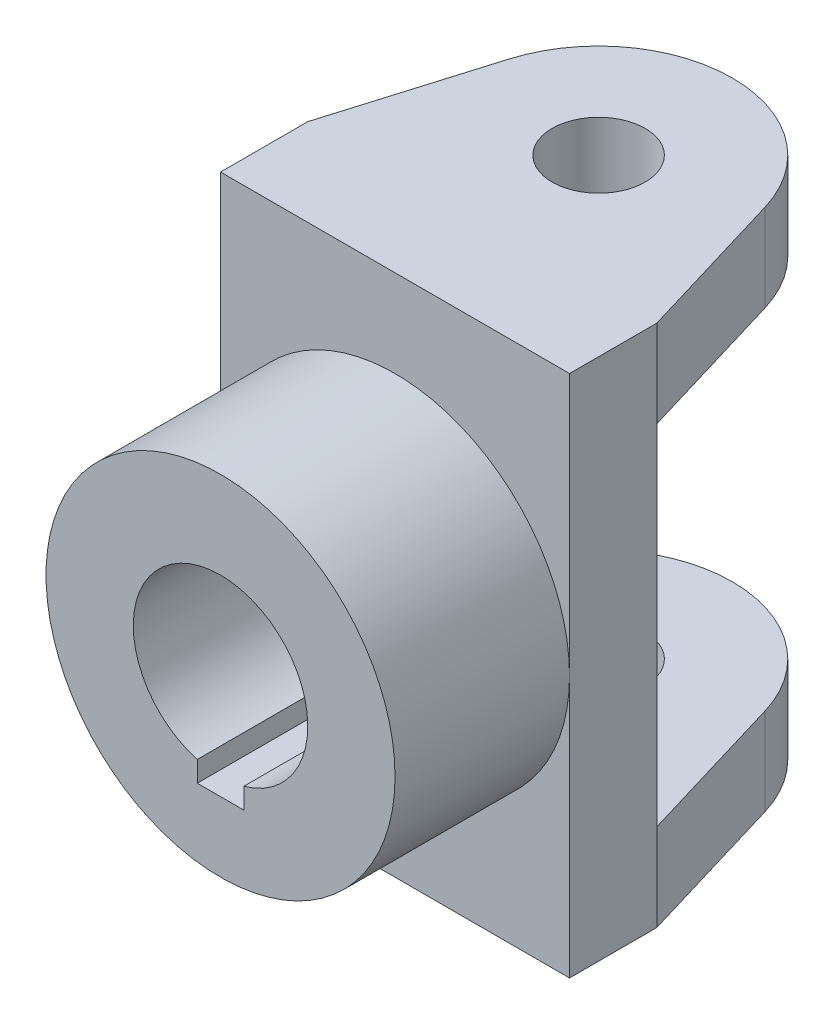
ISO-10303-21;
HEADER;
FILE_DESCRIPTION(('STEP AP214'),'2;1');
FILE_NAME('part.step','',(''),(''),'','','');
FILE_SCHEMA(('AUTOMOTIVE_DESIGN { 1 0 10303 214 1 1 1 1 }'));
ENDSEC;
DATA;
#1=APPLICATION_CONTEXT('core data for automotive mechanical design processes');
#2=APPLICATION_PROTOCOL_DEFINITION('international standard','automotive_design',2000,#1);
#3=PRODUCT_CONTEXT('',#1,'mechanical');
#4=PRODUCT('Part','Part','',(#3));
#5=PRODUCT_RELATED_PRODUCT_CATEGORY('part','',(#4));
#6=PRODUCT_DEFINITION_FORMATION('','',#4);
#7=PRODUCT_DEFINITION_CONTEXT('part definition',#1,'design');
#8=PRODUCT_DEFINITION('design','',#6,#7);
#9=PRODUCT_DEFINITION_SHAPE('','',#8);
#10=(LENGTH_UNIT() NAMED_UNIT(*) SI_UNIT(.MILLI.,.METRE.));
#11=(NAMED_UNIT(*) PLANE_ANGLE_UNIT() SI_UNIT($,.RADIAN.));
#12=(NAMED_UNIT(*) SI_UNIT($,.STERADIAN.) SOLID_ANGLE_UNIT());
#13=UNCERTAINTY_MEASURE_WITH_UNIT(LENGTH_MEASURE(1.E-05),#10,'distance_accuracy_value','');
#14=(GEOMETRIC_REPRESENTATION_CONTEXT(3) GLOBAL_UNCERTAINTY_ASSIGNED_CONTEXT((#13)) GLOBAL_UNIT_ASSIGNED_CONTEXT((#10,
#11,#12)) REPRESENTATION_CONTEXT('',''));
#15=CARTESIAN_POINT('',(0.,0.,0.));
#16=DIRECTION('',(0.,0.,1.));
#17=DIRECTION('',(1.,0.,0.));
#18=AXIS2_PLACEMENT_3D('',#15,#16,#17);
#19=CARTESIAN_POINT('',(0.,0.,0.));
#20=DIRECTION('',(0.,0.,1.));
#21=DIRECTION('',(1.,0.,0.));
#22=AXIS2_PLACEMENT_3D('',#19,#20,#21);
#23=PLANE('',#22);
#24=DIRECTION('',(-1.,0.,0.));
#25=VECTOR('',#24,1.);
#26=CARTESIAN_POINT('',(0.,-30.,0.));
#27=LINE('',#26,#25);
#28=CARTESIAN_POINT('',(30.,-30.,0.));
#29=VERTEX_POINT('',#28);
#30=CARTESIAN_POINT('',(-30.,-30.,0.));
#31=VERTEX_POINT('',#30);
#32=EDGE_CURVE('E58',#29,#31,#27,.T.);
#33=ORIENTED_EDGE('',*,*,#32,.T.);
#34=DIRECTION('',(0.,-1.,0.));
#35=VECTOR('',#34,1.);
#36=CARTESIAN_POINT('',(-30.,-45.,0.));
#37=LINE('',#36,#35);
#38=CARTESIAN_POINT('',(-30.,30.,0.));
#39=VERTEX_POINT('',#38);
#40=EDGE_CURVE('E170',#39,#31,#37,.T.);
#41=ORIENTED_EDGE('',*,*,#40,.F.);
#42=DIRECTION('',(-1.,0.,0.));
#43=VECTOR('',#42,1.);
#44=CARTESIAN_POINT('',(0.,30.,0.));
#45=LINE('',#44,#43);
#46=CARTESIAN_POINT('',(30.,30.,0.));
#47=VERTEX_POINT('',#46);
#48=EDGE_CURVE('E248',#47,#39,#45,.T.);
#49=ORIENTED_EDGE('',*,*,#48,.F.);
#50=DIRECTION('',(0.,1.,0.));
#51=VECTOR('',#50,1.);
#52=CARTESIAN_POINT('',(30.,-45.,0.));
#53=LINE('',#52,#51);
#54=EDGE_CURVE('E66',#29,#47,#53,.T.);
#55=ORIENTED_EDGE('',*,*,#54,.F.);
#56=EDGE_LOOP('',(#33,#41,#49,#55));
#57=FACE_BOUND('',#56,.T.);
#58=ADVANCED_FACE('F41',(#57),#23,.F.);
#59=CARTESIAN_POINT('',(0.,0.,15.));
#60=DIRECTION('',(0.,0.,1.));
#61=DIRECTION('',(1.,0.,0.));
#62=AXIS2_PLACEMENT_3D('',#59,#60,#61);
#63=PLANE('',#62);
#64=CARTESIAN_POINT('',(0.,0.,15.));
#65=DIRECTION('',(0.,0.,1.));
#66=DIRECTION('',(1.,0.,0.));
#67=AXIS2_PLACEMENT_3D('',#64,#65,#66);
#68=CIRCLE('',#67,30.);
#69=CARTESIAN_POINT('',(30.,0.,15.));
#70=VERTEX_POINT('',#69);
#71=CARTESIAN_POINT('',(-30.,0.,15.));
#72=VERTEX_POINT('',#71);
#73=EDGE_CURVE('E51',#70,#72,#68,.T.);
#74=ORIENTED_EDGE('',*,*,#73,.F.);
#75=DIRECTION('',(0.,1.,0.));
#76=VECTOR('',#75,1.);
#77=CARTESIAN_POINT('',(30.,-45.,15.));
#78=LINE('',#77,#76);
#79=CARTESIAN_POINT('',(30.,45.,15.));
#80=VERTEX_POINT('',#79);
#81=EDGE_CURVE('E219',#70,#80,#78,.T.);
#82=ORIENTED_EDGE('',*,*,#81,.T.);
#83=DIRECTION('',(-1.,0.,0.));
#84=VECTOR('',#83,1.);
#85=CARTESIAN_POINT('',(30.,45.,15.));
#86=LINE('',#85,#84);
#87=CARTESIAN_POINT('',(-30.,45.,15.));
#88=VERTEX_POINT('',#87);
#89=EDGE_CURVE('E182',#80,#88,#86,.T.);
#90=ORIENTED_EDGE('',*,*,#89,.T.);
#91=DIRECTION('',(0.,-1.,0.));
#92=VECTOR('',#91,1.);
#93=CARTESIAN_POINT('',(-30.,-45.,15.));
#94=LINE('',#93,#92);
#95=EDGE_CURVE('E203',#88,#72,#94,.T.);
#96=ORIENTED_EDGE('',*,*,#95,.T.);
#97=EDGE_LOOP('',(#74,#82,#90,#96));
#98=FACE_BOUND('',#97,.T.);
#99=ADVANCED_FACE('F209',(#98),#63,.T.);
#100=CARTESIAN_POINT('',(-30.,-45.,15.));
#101=DIRECTION('',(1.,0.,0.));
#102=DIRECTION('',(0.,0.,-1.));
#103=AXIS2_PLACEMENT_3D('',#100,#101,#102);
#104=PLANE('',#103);
#105=CARTESIAN_POINT('',(-30.,45.,0.));
#106=VERTEX_POINT('',#105);
#107=EDGE_CURVE('E175',#106,#39,#37,.T.);
#108=ORIENTED_EDGE('',*,*,#107,.T.);
#109=ORIENTED_EDGE('',*,*,#40,.T.);
#110=DIRECTION('',(0.,-1.,0.));
#111=VECTOR('',#110,1.);
#112=CARTESIAN_POINT('',(-30.,-30.,0.));
#113=LINE('',#112,#111);
#114=CARTESIAN_POINT('',(-30.,-45.,0.));
#115=VERTEX_POINT('',#114);
#116=EDGE_CURVE('E153',#31,#115,#113,.T.);
#117=ORIENTED_EDGE('',*,*,#116,.T.);
#118=DIRECTION('',(0.,0.,-1.));
#119=VECTOR('',#118,1.);
#120=CARTESIAN_POINT('',(-30.,-45.,15.));
#121=LINE('',#120,#119);
#122=CARTESIAN_POINT('',(-30.,-45.,15.));
#123=VERTEX_POINT('',#122);
#124=EDGE_CURVE('E45',#123,#115,#121,.T.);
#125=ORIENTED_EDGE('',*,*,#124,.F.);
#126=EDGE_CURVE('E186',#72,#123,#94,.T.);
#127=ORIENTED_EDGE('',*,*,#126,.F.);
#128=ORIENTED_EDGE('',*,*,#95,.F.);
#129=DIRECTION('',(0.,0.,-1.));
#130=VECTOR('',#129,1.);
#131=CARTESIAN_POINT('',(-30.,45.,15.));
#132=LINE('',#131,#130);
#133=EDGE_CURVE('E187',#88,#106,#132,.T.);
#134=ORIENTED_EDGE('',*,*,#133,.T.);
#135=EDGE_LOOP('',(#108,#109,#117,#125,#127,#128,#134));
#136=FACE_BOUND('',#135,.T.);
#137=ADVANCED_FACE('F43',(#136),#104,.F.);
#138=CARTESIAN_POINT('',(30.,-45.,15.));
#139=DIRECTION('',(0.,1.,0.));
#140=DIRECTION('',(-1.,0.,0.));
#141=AXIS2_PLACEMENT_3D('',#138,#139,#140);
#142=PLANE('',#141);
#143=ORIENTED_EDGE('',*,*,#124,.T.);
#144=DIRECTION('',(0.286928155857607,0.,-0.957952103905072));
#145=VECTOR('',#144,1.);
#146=CARTESIAN_POINT('',(-27.5301670012846,-45.,-8.2459029172019));
#147=LINE('',#146,#145);
#148=CARTESIAN_POINT('',(-22.0328983898167,-45.,-26.599347584725));
#149=VERTEX_POINT('',#148);
#150=EDGE_CURVE('E157',#115,#149,#147,.T.);
#151=ORIENTED_EDGE('',*,*,#150,.T.);
#152=CARTESIAN_POINT('',(0.,-45.,-20.));
#153=DIRECTION('',(0.,1.,0.));
#154=DIRECTION('',(-1.,0.,0.));
#155=AXIS2_PLACEMENT_3D('',#152,#153,#154);
#156=CIRCLE('',#155,23.);
#157=CARTESIAN_POINT('',(22.0328983898166,-45.,-26.599347584725));
#158=VERTEX_POINT('',#157);
#159=EDGE_CURVE('E467',#158,#149,#156,.T.);
#160=ORIENTED_EDGE('',*,*,#159,.F.);
#161=DIRECTION('',(-0.286928155857607,0.,-0.957952103905072));
#162=VECTOR('',#161,1.);
#163=CARTESIAN_POINT('',(27.5301670012846,-45.,-8.24590291720191));
#164=LINE('',#163,#162);
#165=CARTESIAN_POINT('',(30.,-45.,0.));
#166=VERTEX_POINT('',#165);
#167=EDGE_CURVE('E477',#166,#158,#164,.T.);
#168=ORIENTED_EDGE('',*,*,#167,.F.);
#169=DIRECTION('',(0.,0.,-1.));
#170=VECTOR('',#169,1.);
#171=CARTESIAN_POINT('',(30.,-45.,15.));
#172=LINE('',#171,#170);
#173=CARTESIAN_POINT('',(30.,-45.,15.));
#174=VERTEX_POINT('',#173);
#175=EDGE_CURVE('E191',#174,#166,#172,.T.);
#176=ORIENTED_EDGE('',*,*,#175,.F.);
#177=DIRECTION('',(1.,0.,0.));
#178=VECTOR('',#177,1.);
#179=CARTESIAN_POINT('',(30.,-45.,15.));
#180=LINE('',#179,#178);
#181=EDGE_CURVE('E199',#123,#174,#180,.T.);
#182=ORIENTED_EDGE('',*,*,#181,.F.);
#183=EDGE_LOOP('',(#143,#151,#160,#168,#176,#182));
#184=FACE_BOUND('',#183,.T.);
#185=CARTESIAN_POINT('',(0.,-45.,-20.));
#186=DIRECTION('',(0.,1.,0.));
#187=DIRECTION('',(-1.,0.,0.));
#188=AXIS2_PLACEMENT_3D('',#185,#186,#187);
#189=CIRCLE('',#188,8.);
#190=CARTESIAN_POINT('',(-8.00000000000001,-45.,-20.));
#191=VERTEX_POINT('',#190);
#192=EDGE_CURVE('E474',#191,#191,#189,.T.);
#193=ORIENTED_EDGE('',*,*,#192,.T.);
#194=EDGE_LOOP('',(#193));
#195=FACE_BOUND('',#194,.T.);
#196=ADVANCED_FACE('F197',(#184,#195),#142,.F.);
#197=CARTESIAN_POINT('',(30.,-45.,15.));
#198=DIRECTION('',(-1.,0.,0.));
#199=DIRECTION('',(0.,0.,1.));
#200=AXIS2_PLACEMENT_3D('',#197,#198,#199);
#201=PLANE('',#200);
#202=EDGE_CURVE('E184',#166,#29,#53,.T.);
#203=ORIENTED_EDGE('',*,*,#202,.T.);
#204=ORIENTED_EDGE('',*,*,#54,.T.);
#205=DIRECTION('',(0.,1.,0.));
#206=VECTOR('',#205,1.);
#207=CARTESIAN_POINT('',(30.,30.,0.));
#208=LINE('',#207,#206);
#209=CARTESIAN_POINT('',(30.,45.,0.));
#210=VERTEX_POINT('',#209);
#211=EDGE_CURVE('E225',#47,#210,#208,.T.);
#212=ORIENTED_EDGE('',*,*,#211,.T.);
#213=DIRECTION('',(0.,0.,-1.));
#214=VECTOR('',#213,1.);
#215=CARTESIAN_POINT('',(30.,45.,15.));
#216=LINE('',#215,#214);
#217=EDGE_CURVE('E189',#80,#210,#216,.T.);
#218=ORIENTED_EDGE('',*,*,#217,.F.);
#219=ORIENTED_EDGE('',*,*,#81,.F.);
#220=EDGE_CURVE('E220',#174,#70,#78,.T.);
#221=ORIENTED_EDGE('',*,*,#220,.F.);
#222=ORIENTED_EDGE('',*,*,#175,.T.);
#223=EDGE_LOOP('',(#203,#204,#212,#218,#219,#221,#222));
#224=FACE_BOUND('',#223,.T.);
#225=ADVANCED_FACE('F223',(#224),#201,.F.);
#226=CARTESIAN_POINT('',(30.,45.,15.));
#227=DIRECTION('',(0.,-1.,0.));
#228=DIRECTION('',(1.,0.,0.));
#229=AXIS2_PLACEMENT_3D('',#226,#227,#228);
#230=PLANE('',#229);
#231=ORIENTED_EDGE('',*,*,#217,.T.);
#232=DIRECTION('',(-0.286928155857607,0.,-0.957952103905072));
#233=VECTOR('',#232,1.);
#234=CARTESIAN_POINT('',(27.5301670012846,45.,-8.24590291720191));
#235=LINE('',#234,#233);
#236=CARTESIAN_POINT('',(22.0328983898166,45.,-26.599347584725));
#237=VERTEX_POINT('',#236);
#238=EDGE_CURVE('E263',#210,#237,#235,.T.);
#239=ORIENTED_EDGE('',*,*,#238,.T.);
#240=CARTESIAN_POINT('',(0.,45.,-20.));
#241=DIRECTION('',(0.,1.,0.));
#242=DIRECTION('',(-1.,0.,0.));
#243=AXIS2_PLACEMENT_3D('',#240,#241,#242);
#244=CIRCLE('',#243,23.);
#245=CARTESIAN_POINT('',(-22.0328983898167,45.,-26.599347584725));
#246=VERTEX_POINT('',#245);
#247=EDGE_CURVE('E236',#237,#246,#244,.T.);
#248=ORIENTED_EDGE('',*,*,#247,.T.);
#249=DIRECTION('',(0.286928155857607,0.,-0.957952103905072));
#250=VECTOR('',#249,1.);
#251=CARTESIAN_POINT('',(-27.5301670012846,45.,-8.2459029172019));
#252=LINE('',#251,#250);
#253=EDGE_CURVE('E234',#106,#246,#252,.T.);
#254=ORIENTED_EDGE('',*,*,#253,.F.);
#255=ORIENTED_EDGE('',*,*,#133,.F.);
#256=ORIENTED_EDGE('',*,*,#89,.F.);
#257=EDGE_LOOP('',(#231,#239,#248,#254,#255,#256));
#258=FACE_BOUND('',#257,.T.);
#259=CARTESIAN_POINT('',(0.,45.,-20.));
#260=DIRECTION('',(0.,1.,0.));
#261=DIRECTION('',(-1.,0.,0.));
#262=AXIS2_PLACEMENT_3D('',#259,#260,#261);
#263=CIRCLE('',#262,8.);
#264=CARTESIAN_POINT('',(-8.00000000000001,45.,-20.));
#265=VERTEX_POINT('',#264);
#266=EDGE_CURVE('E260',#265,#265,#263,.T.);
#267=ORIENTED_EDGE('',*,*,#266,.F.);
#268=EDGE_LOOP('',(#267));
#269=FACE_BOUND('',#268,.T.);
#270=ADVANCED_FACE('F229',(#258,#269),#230,.F.);
#271=EDGE_CURVE('E11',#72,#70,#68,.T.);
#272=ORIENTED_EDGE('',*,*,#271,.F.);
#273=ORIENTED_EDGE('',*,*,#126,.T.);
#274=ORIENTED_EDGE('',*,*,#181,.T.);
#275=ORIENTED_EDGE('',*,*,#220,.T.);
#276=EDGE_LOOP('',(#272,#273,#274,#275));
#277=FACE_BOUND('',#276,.T.);
#278=ADVANCED_FACE('F324',(#277),#63,.T.);
#279=CARTESIAN_POINT('',(0.,0.,45.));
#280=DIRECTION('',(0.,0.,1.));
#281=DIRECTION('',(1.,0.,0.));
#282=AXIS2_PLACEMENT_3D('',#279,#280,#281);
#283=PLANE('',#282);
#284=CARTESIAN_POINT('',(0.,0.,45.));
#285=DIRECTION('',(0.,0.,1.));
#286=DIRECTION('',(1.,0.,0.));
#287=AXIS2_PLACEMENT_3D('',#284,#285,#286);
#288=CIRCLE('',#287,30.);
#289=CARTESIAN_POINT('',(30.,0.,45.));
#290=VERTEX_POINT('',#289);
#291=EDGE_CURVE('E176',#290,#290,#288,.T.);
#292=ORIENTED_EDGE('',*,*,#291,.T.);
#293=EDGE_LOOP('',(#292));
#294=FACE_BOUND('',#293,.T.);
#295=DIRECTION('',(0.,1.,0.));
#296=VECTOR('',#295,1.);
#297=CARTESIAN_POINT('',(4.,-14.456832294801,45.));
#298=LINE('',#297,#296);
#299=CARTESIAN_POINT('',(4.,-18.,45.));
#300=VERTEX_POINT('',#299);
#301=CARTESIAN_POINT('',(4.,-14.456832294801,45.));
#302=VERTEX_POINT('',#301);
#303=EDGE_CURVE('E272',#300,#302,#298,.T.);
#304=ORIENTED_EDGE('',*,*,#303,.F.);
#305=DIRECTION('',(1.,0.,0.));
#306=VECTOR('',#305,1.);
#307=CARTESIAN_POINT('',(-4.,-18.,45.));
#308=LINE('',#307,#306);
#309=CARTESIAN_POINT('',(-4.,-18.,45.));
#310=VERTEX_POINT('',#309);
#311=EDGE_CURVE('E270',#310,#300,#308,.T.);
#312=ORIENTED_EDGE('',*,*,#311,.F.);
#313=DIRECTION('',(0.,-1.,0.));
#314=VECTOR('',#313,1.);
#315=CARTESIAN_POINT('',(-4.,-14.456832294801,45.));
#316=LINE('',#315,#314);
#317=CARTESIAN_POINT('',(-4.,-14.456832294801,45.));
#318=VERTEX_POINT('',#317);
#319=EDGE_CURVE('E278',#318,#310,#316,.T.);
#320=ORIENTED_EDGE('',*,*,#319,.F.);
#321=CARTESIAN_POINT('',(0.,0.,45.));
#322=DIRECTION('',(0.,0.,1.));
#323=DIRECTION('',(1.,0.,0.));
#324=AXIS2_PLACEMENT_3D('',#321,#322,#323);
#325=CIRCLE('',#324,15.);
#326=EDGE_CURVE('E275',#302,#318,#325,.T.);
#327=ORIENTED_EDGE('',*,*,#326,.F.);
#328=EDGE_LOOP('',(#304,#312,#320,#327));
#329=FACE_BOUND('',#328,.T.);
#330=ADVANCED_FACE('F312',(#294,#329),#283,.T.);
#331=CARTESIAN_POINT('',(0.,0.,45.));
#332=DIRECTION('',(0.,0.,-1.));
#333=DIRECTION('',(-1.,0.,0.));
#334=AXIS2_PLACEMENT_3D('',#331,#332,#333);
#335=CYLINDRICAL_SURFACE('',#334,30.);
#336=ORIENTED_EDGE('',*,*,#291,.F.);
#337=EDGE_LOOP('',(#336));
#338=FACE_BOUND('',#337,.T.);
#339=ORIENTED_EDGE('',*,*,#73,.T.);
#340=ORIENTED_EDGE('',*,*,#271,.T.);
#341=EDGE_LOOP('',(#339,#340));
#342=FACE_BOUND('',#341,.T.);
#343=ADVANCED_FACE('F213',(#338,#342),#335,.T.);
#344=CARTESIAN_POINT('',(-4.,-18.,45.));
#345=DIRECTION('',(0.,1.,0.));
#346=DIRECTION('',(0.,0.,1.));
#347=AXIS2_PLACEMENT_3D('',#344,#345,#346);
#348=PLANE('',#347);
#349=DIRECTION('',(1.,0.,0.));
#350=VECTOR('',#349,1.);
#351=CARTESIAN_POINT('',(-4.,-18.,15.));
#352=LINE('',#351,#350);
#353=CARTESIAN_POINT('',(-4.,-18.,15.));
#354=VERTEX_POINT('',#353);
#355=CARTESIAN_POINT('',(4.,-18.,15.));
#356=VERTEX_POINT('',#355);
#357=EDGE_CURVE('E268',#354,#356,#352,.T.);
#358=ORIENTED_EDGE('',*,*,#357,.F.);
#359=DIRECTION('',(0.,0.,-1.));
#360=VECTOR('',#359,1.);
#361=CARTESIAN_POINT('',(-4.,-18.,45.));
#362=LINE('',#361,#360);
#363=EDGE_CURVE('E280',#310,#354,#362,.T.);
#364=ORIENTED_EDGE('',*,*,#363,.F.);
#365=ORIENTED_EDGE('',*,*,#311,.T.);
#366=DIRECTION('',(0.,0.,-1.));
#367=VECTOR('',#366,1.);
#368=CARTESIAN_POINT('',(4.,-18.,45.));
#369=LINE('',#368,#367);
#370=EDGE_CURVE('E214',#300,#356,#369,.T.);
#371=ORIENTED_EDGE('',*,*,#370,.T.);
#372=EDGE_LOOP('',(#358,#364,#365,#371));
#373=FACE_BOUND('',#372,.T.);
#374=ADVANCED_FACE('F309',(#373),#348,.T.);
#375=CARTESIAN_POINT('',(4.,-14.456832294801,45.));
#376=DIRECTION('',(-1.,0.,0.));
#377=DIRECTION('',(0.,-1.,0.));
#378=AXIS2_PLACEMENT_3D('',#375,#376,#377);
#379=PLANE('',#378);
#380=DIRECTION('',(0.,1.,0.));
#381=VECTOR('',#380,1.);
#382=CARTESIAN_POINT('',(4.,-14.456832294801,15.));
#383=LINE('',#382,#381);
#384=CARTESIAN_POINT('',(4.,-14.456832294801,15.));
#385=VERTEX_POINT('',#384);
#386=EDGE_CURVE('E283',#356,#385,#383,.T.);
#387=ORIENTED_EDGE('',*,*,#386,.F.);
#388=ORIENTED_EDGE('',*,*,#370,.F.);
#389=ORIENTED_EDGE('',*,*,#303,.T.);
#390=DIRECTION('',(0.,0.,-1.));
#391=VECTOR('',#390,1.);
#392=CARTESIAN_POINT('',(4.,-14.456832294801,45.));
#393=LINE('',#392,#391);
#394=EDGE_CURVE('E216',#302,#385,#393,.T.);
#395=ORIENTED_EDGE('',*,*,#394,.T.);
#396=EDGE_LOOP('',(#387,#388,#389,#395));
#397=FACE_BOUND('',#396,.T.);
#398=ADVANCED_FACE('F297',(#397),#379,.T.);
#399=CARTESIAN_POINT('',(0.,0.,45.));
#400=DIRECTION('',(0.,0.,-1.));
#401=DIRECTION('',(-1.,0.,0.));
#402=AXIS2_PLACEMENT_3D('',#399,#400,#401);
#403=CYLINDRICAL_SURFACE('',#402,15.);
#404=CARTESIAN_POINT('',(0.,0.,15.));
#405=DIRECTION('',(0.,0.,1.));
#406=DIRECTION('',(1.,0.,0.));
#407=AXIS2_PLACEMENT_3D('',#404,#405,#406);
#408=CIRCLE('',#407,15.);
#409=CARTESIAN_POINT('',(-4.,-14.456832294801,15.));
#410=VERTEX_POINT('',#409);
#411=EDGE_CURVE('E286',#385,#410,#408,.T.);
#412=ORIENTED_EDGE('',*,*,#411,.F.);
#413=ORIENTED_EDGE('',*,*,#394,.F.);
#414=ORIENTED_EDGE('',*,*,#326,.T.);
#415=DIRECTION('',(0.,0.,-1.));
#416=VECTOR('',#415,1.);
#417=CARTESIAN_POINT('',(-4.,-14.456832294801,45.));
#418=LINE('',#417,#416);
#419=EDGE_CURVE('E292',#318,#410,#418,.T.);
#420=ORIENTED_EDGE('',*,*,#419,.T.);
#421=EDGE_LOOP('',(#412,#413,#414,#420));
#422=FACE_BOUND('',#421,.T.);
#423=ADVANCED_FACE('F302',(#422),#403,.F.);
#424=CARTESIAN_POINT('',(-4.,-14.456832294801,45.));
#425=DIRECTION('',(1.,0.,0.));
#426=DIRECTION('',(0.,1.,0.));
#427=AXIS2_PLACEMENT_3D('',#424,#425,#426);
#428=PLANE('',#427);
#429=DIRECTION('',(0.,-1.,0.));
#430=VECTOR('',#429,1.);
#431=CARTESIAN_POINT('',(-4.,-14.456832294801,15.));
#432=LINE('',#431,#430);
#433=EDGE_CURVE('E273',#410,#354,#432,.T.);
#434=ORIENTED_EDGE('',*,*,#433,.F.);
#435=ORIENTED_EDGE('',*,*,#419,.F.);
#436=ORIENTED_EDGE('',*,*,#319,.T.);
#437=ORIENTED_EDGE('',*,*,#363,.T.);
#438=EDGE_LOOP('',(#434,#435,#436,#437));
#439=FACE_BOUND('',#438,.T.);
#440=ADVANCED_FACE('F315',(#439),#428,.T.);
#441=ORIENTED_EDGE('',*,*,#433,.T.);
#442=ORIENTED_EDGE('',*,*,#357,.T.);
#443=ORIENTED_EDGE('',*,*,#386,.T.);
#444=ORIENTED_EDGE('',*,*,#411,.T.);
#445=EDGE_LOOP('',(#441,#442,#443,#444));
#446=FACE_BOUND('',#445,.T.);
#447=ADVANCED_FACE('F305',(#446),#63,.T.);
#448=CARTESIAN_POINT('',(27.5301670012846,30.,-8.24590291720191));
#449=DIRECTION('',(0.957952103905071,0.,-0.286928155857607));
#450=DIRECTION('',(-0.286928155857607,0.,-0.957952103905071));
#451=AXIS2_PLACEMENT_3D('',#448,#449,#450);
#452=PLANE('',#451);
#453=ORIENTED_EDGE('',*,*,#238,.F.);
#454=ORIENTED_EDGE('',*,*,#211,.F.);
#455=DIRECTION('',(-0.286928155857607,0.,-0.957952103905072));
#456=VECTOR('',#455,1.);
#457=CARTESIAN_POINT('',(27.5301670012846,30.,-8.24590291720191));
#458=LINE('',#457,#456);
#459=CARTESIAN_POINT('',(22.0328983898166,30.,-26.599347584725));
#460=VERTEX_POINT('',#459);
#461=EDGE_CURVE('E254',#47,#460,#458,.T.);
#462=ORIENTED_EDGE('',*,*,#461,.T.);
#463=DIRECTION('',(0.,1.,0.));
#464=VECTOR('',#463,1.);
#465=CARTESIAN_POINT('',(22.0328983898166,30.,-26.599347584725));
#466=LINE('',#465,#464);
#467=EDGE_CURVE('E255',#460,#237,#466,.T.);
#468=ORIENTED_EDGE('',*,*,#467,.T.);
#469=EDGE_LOOP('',(#453,#454,#462,#468));
#470=FACE_BOUND('',#469,.T.);
#471=ADVANCED_FACE('F322',(#470),#452,.T.);
#472=CARTESIAN_POINT('',(-27.5301670012846,30.,-8.2459029172019));
#473=DIRECTION('',(0.957952103905071,0.,0.286928155857607));
#474=DIRECTION('',(0.286928155857607,0.,-0.957952103905071));
#475=AXIS2_PLACEMENT_3D('',#472,#473,#474);
#476=PLANE('',#475);
#477=ORIENTED_EDGE('',*,*,#253,.T.);
#478=DIRECTION('',(0.,1.,0.));
#479=VECTOR('',#478,1.);
#480=CARTESIAN_POINT('',(-22.0328983898167,30.,-26.599347584725));
#481=LINE('',#480,#479);
#482=CARTESIAN_POINT('',(-22.0328983898167,30.,-26.599347584725));
#483=VERTEX_POINT('',#482);
#484=EDGE_CURVE('E244',#483,#246,#481,.T.);
#485=ORIENTED_EDGE('',*,*,#484,.F.);
#486=DIRECTION('',(0.286928155857607,0.,-0.957952103905072));
#487=VECTOR('',#486,1.);
#488=CARTESIAN_POINT('',(-27.5301670012846,30.,-8.2459029172019));
#489=LINE('',#488,#487);
#490=EDGE_CURVE('E242',#39,#483,#489,.T.);
#491=ORIENTED_EDGE('',*,*,#490,.F.);
#492=ORIENTED_EDGE('',*,*,#107,.F.);
#493=EDGE_LOOP('',(#477,#485,#491,#492));
#494=FACE_BOUND('',#493,.T.);
#495=ADVANCED_FACE('F241',(#494),#476,.F.);
#496=CARTESIAN_POINT('',(0.,30.,-20.));
#497=DIRECTION('',(0.,1.,0.));
#498=DIRECTION('',(-1.,0.,0.));
#499=AXIS2_PLACEMENT_3D('',#496,#497,#498);
#500=CYLINDRICAL_SURFACE('',#499,8.);
#501=CARTESIAN_POINT('',(0.,30.,-20.));
#502=DIRECTION('',(0.,1.,0.));
#503=DIRECTION('',(-1.,0.,0.));
#504=AXIS2_PLACEMENT_3D('',#501,#502,#503);
#505=CIRCLE('',#504,8.);
#506=CARTESIAN_POINT('',(-8.00000000000001,30.,-20.));
#507=VERTEX_POINT('',#506);
#508=EDGE_CURVE('E239',#507,#507,#505,.T.);
#509=ORIENTED_EDGE('',*,*,#508,.F.);
#510=EDGE_LOOP('',(#509));
#511=FACE_BOUND('',#510,.T.);
#512=ORIENTED_EDGE('',*,*,#266,.T.);
#513=EDGE_LOOP('',(#512));
#514=FACE_BOUND('',#513,.T.);
#515=ADVANCED_FACE('F420',(#511,#514),#500,.F.);
#516=CARTESIAN_POINT('',(0.,30.,-20.));
#517=DIRECTION('',(0.,1.,0.));
#518=DIRECTION('',(-1.,0.,0.));
#519=AXIS2_PLACEMENT_3D('',#516,#517,#518);
#520=CYLINDRICAL_SURFACE('',#519,23.);
#521=ORIENTED_EDGE('',*,*,#247,.F.);
#522=ORIENTED_EDGE('',*,*,#467,.F.);
#523=CARTESIAN_POINT('',(0.,30.,-20.));
#524=DIRECTION('',(0.,1.,0.));
#525=DIRECTION('',(-1.,0.,0.));
#526=AXIS2_PLACEMENT_3D('',#523,#524,#525);
#527=CIRCLE('',#526,23.);
#528=EDGE_CURVE('E249',#460,#483,#527,.T.);
#529=ORIENTED_EDGE('',*,*,#528,.T.);
#530=ORIENTED_EDGE('',*,*,#484,.T.);
#531=EDGE_LOOP('',(#521,#522,#529,#530));
#532=FACE_BOUND('',#531,.T.);
#533=ADVANCED_FACE('F427',(#532),#520,.T.);
#534=CARTESIAN_POINT('',(0.,30.,0.));
#535=DIRECTION('',(0.,1.,0.));
#536=DIRECTION('',(-1.,0.,0.));
#537=AXIS2_PLACEMENT_3D('',#534,#535,#536);
#538=PLANE('',#537);
#539=ORIENTED_EDGE('',*,*,#508,.T.);
#540=EDGE_LOOP('',(#539));
#541=FACE_BOUND('',#540,.T.);
#542=ORIENTED_EDGE('',*,*,#461,.F.);
#543=ORIENTED_EDGE('',*,*,#48,.T.);
#544=ORIENTED_EDGE('',*,*,#490,.T.);
#545=ORIENTED_EDGE('',*,*,#528,.F.);
#546=EDGE_LOOP('',(#542,#543,#544,#545));
#547=FACE_BOUND('',#546,.T.);
#548=ADVANCED_FACE('F252',(#541,#547),#538,.F.);
#549=CARTESIAN_POINT('',(27.5301670012846,-30.,-8.24590291720191));
#550=DIRECTION('',(-0.957952103905071,0.,0.286928155857607));
#551=DIRECTION('',(0.286928155857607,0.,0.957952103905071));
#552=AXIS2_PLACEMENT_3D('',#549,#550,#551);
#553=PLANE('',#552);
#554=ORIENTED_EDGE('',*,*,#167,.T.);
#555=DIRECTION('',(0.,-1.,0.));
#556=VECTOR('',#555,1.);
#557=CARTESIAN_POINT('',(22.0328983898166,-30.,-26.599347584725));
#558=LINE('',#557,#556);
#559=CARTESIAN_POINT('',(22.0328983898166,-30.,-26.599347584725));
#560=VERTEX_POINT('',#559);
#561=EDGE_CURVE('E264',#560,#158,#558,.T.);
#562=ORIENTED_EDGE('',*,*,#561,.F.);
#563=DIRECTION('',(-0.286928155857607,0.,-0.957952103905072));
#564=VECTOR('',#563,1.);
#565=CARTESIAN_POINT('',(27.5301670012846,-30.,-8.24590291720191));
#566=LINE('',#565,#564);
#567=EDGE_CURVE('E172',#29,#560,#566,.T.);
#568=ORIENTED_EDGE('',*,*,#567,.F.);
#569=ORIENTED_EDGE('',*,*,#202,.F.);
#570=EDGE_LOOP('',(#554,#562,#568,#569));
#571=FACE_BOUND('',#570,.T.);
#572=ADVANCED_FACE('F439',(#571),#553,.F.);
#573=CARTESIAN_POINT('',(0.,-30.,-20.));
#574=DIRECTION('',(0.,-1.,0.));
#575=DIRECTION('',(1.,0.,0.));
#576=AXIS2_PLACEMENT_3D('',#573,#574,#575);
#577=CYLINDRICAL_SURFACE('',#576,23.);
#578=ORIENTED_EDGE('',*,*,#159,.T.);
#579=DIRECTION('',(0.,-1.,0.));
#580=VECTOR('',#579,1.);
#581=CARTESIAN_POINT('',(-22.0328983898167,-30.,-26.599347584725));
#582=LINE('',#581,#580);
#583=CARTESIAN_POINT('',(-22.0328983898167,-30.,-26.599347584725));
#584=VERTEX_POINT('',#583);
#585=EDGE_CURVE('E162',#584,#149,#582,.T.);
#586=ORIENTED_EDGE('',*,*,#585,.F.);
#587=CARTESIAN_POINT('',(0.,-30.,-20.));
#588=DIRECTION('',(0.,1.,0.));
#589=DIRECTION('',(-1.,0.,0.));
#590=AXIS2_PLACEMENT_3D('',#587,#588,#589);
#591=CIRCLE('',#590,23.);
#592=EDGE_CURVE('E163',#560,#584,#591,.T.);
#593=ORIENTED_EDGE('',*,*,#592,.F.);
#594=ORIENTED_EDGE('',*,*,#561,.T.);
#595=EDGE_LOOP('',(#578,#586,#593,#594));
#596=FACE_BOUND('',#595,.T.);
#597=ADVANCED_FACE('F446',(#596),#577,.T.);
#598=CARTESIAN_POINT('',(-27.5301670012846,-30.,-8.2459029172019));
#599=DIRECTION('',(-0.957952103905071,0.,-0.286928155857607));
#600=DIRECTION('',(-0.286928155857607,0.,0.957952103905071));
#601=AXIS2_PLACEMENT_3D('',#598,#599,#600);
#602=PLANE('',#601);
#603=ORIENTED_EDGE('',*,*,#150,.F.);
#604=ORIENTED_EDGE('',*,*,#116,.F.);
#605=DIRECTION('',(0.286928155857607,0.,-0.957952103905072));
#606=VECTOR('',#605,1.);
#607=CARTESIAN_POINT('',(-27.5301670012846,-30.,-8.2459029172019));
#608=LINE('',#607,#606);
#609=EDGE_CURVE('E155',#31,#584,#608,.T.);
#610=ORIENTED_EDGE('',*,*,#609,.T.);
#611=ORIENTED_EDGE('',*,*,#585,.T.);
#612=EDGE_LOOP('',(#603,#604,#610,#611));
#613=FACE_BOUND('',#612,.T.);
#614=ADVANCED_FACE('F154',(#613),#602,.T.);
#615=CARTESIAN_POINT('',(0.,-30.,-20.));
#616=DIRECTION('',(0.,-1.,0.));
#617=DIRECTION('',(1.,0.,0.));
#618=AXIS2_PLACEMENT_3D('',#615,#616,#617);
#619=CYLINDRICAL_SURFACE('',#618,8.);
#620=CARTESIAN_POINT('',(0.,-30.,-20.));
#621=DIRECTION('',(0.,1.,0.));
#622=DIRECTION('',(-1.,0.,0.));
#623=AXIS2_PLACEMENT_3D('',#620,#621,#622);
#624=CIRCLE('',#623,8.);
#625=CARTESIAN_POINT('',(-8.00000000000001,-30.,-20.));
#626=VERTEX_POINT('',#625);
#627=EDGE_CURVE('E466',#626,#626,#624,.T.);
#628=ORIENTED_EDGE('',*,*,#627,.T.);
#629=EDGE_LOOP('',(#628));
#630=FACE_BOUND('',#629,.T.);
#631=ORIENTED_EDGE('',*,*,#192,.F.);
#632=EDGE_LOOP('',(#631));
#633=FACE_BOUND('',#632,.T.);
#634=ADVANCED_FACE('F451',(#630,#633),#619,.F.);
#635=CARTESIAN_POINT('',(0.,-30.,0.));
#636=DIRECTION('',(0.,-1.,0.));
#637=DIRECTION('',(-1.,0.,0.));
#638=AXIS2_PLACEMENT_3D('',#635,#636,#637);
#639=PLANE('',#638);
#640=ORIENTED_EDGE('',*,*,#627,.F.);
#641=EDGE_LOOP('',(#640));
#642=FACE_BOUND('',#641,.T.);
#643=ORIENTED_EDGE('',*,*,#567,.T.);
#644=ORIENTED_EDGE('',*,*,#592,.T.);
#645=ORIENTED_EDGE('',*,*,#609,.F.);
#646=ORIENTED_EDGE('',*,*,#32,.F.);
#647=EDGE_LOOP('',(#643,#644,#645,#646));
#648=FACE_BOUND('',#647,.T.);
#649=ADVANCED_FACE('F165',(#642,#648),#639,.F.);
#650=CLOSED_SHELL('',(#58,#99,#137,#196,#225,#270,#278,#330,#343,#374,#398,#423,#440,#447,#471,
#495,#515,#533,#548,#572,#597,#614,#634,#649));
#651=MANIFOLD_SOLID_BREP('B2',#650);
#652=ADVANCED_BREP_SHAPE_REPRESENTATION('',(#18,#651),#14);
#653=SHAPE_DEFINITION_REPRESENTATION(#9,#652);
ENDSEC;
END-ISO-10303-21;
